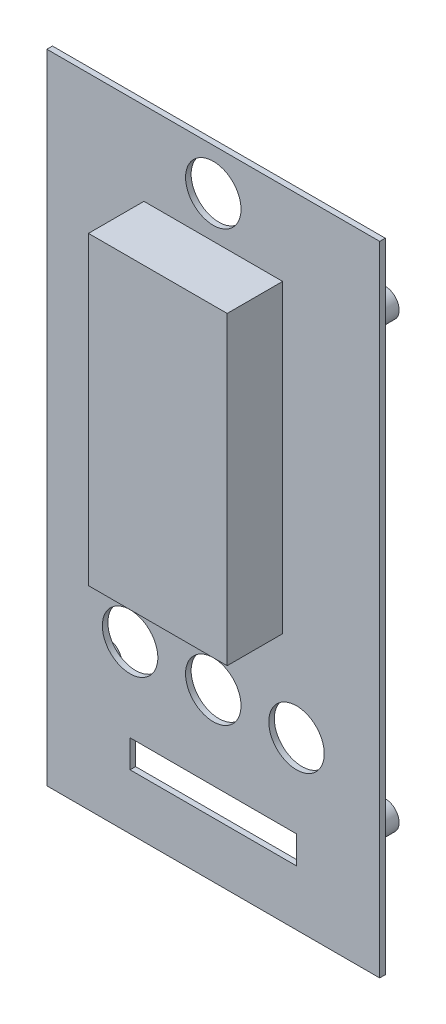
ISO-10303-21;
HEADER;
FILE_DESCRIPTION(('STEP AP214'),'2;1');
FILE_NAME('part.step','',(''),(''),'','','');
FILE_SCHEMA(('AUTOMOTIVE_DESIGN { 1 0 10303 214 1 1 1 1 }'));
ENDSEC;
DATA;
#1=APPLICATION_CONTEXT('core data for automotive mechanical design processes');
#2=APPLICATION_PROTOCOL_DEFINITION('international standard','automotive_design',2000,#1);
#3=PRODUCT_CONTEXT('',#1,'mechanical');
#4=PRODUCT('Part','Part','',(#3));
#5=PRODUCT_RELATED_PRODUCT_CATEGORY('part','',(#4));
#6=PRODUCT_DEFINITION_FORMATION('','',#4);
#7=PRODUCT_DEFINITION_CONTEXT('part definition',#1,'design');
#8=PRODUCT_DEFINITION('design','',#6,#7);
#9=PRODUCT_DEFINITION_SHAPE('','',#8);
#10=(LENGTH_UNIT() NAMED_UNIT(*) SI_UNIT(.MILLI.,.METRE.));
#11=(NAMED_UNIT(*) PLANE_ANGLE_UNIT() SI_UNIT($,.RADIAN.));
#12=(NAMED_UNIT(*) SI_UNIT($,.STERADIAN.) SOLID_ANGLE_UNIT());
#13=UNCERTAINTY_MEASURE_WITH_UNIT(LENGTH_MEASURE(1.E-05),#10,'distance_accuracy_value','');
#14=(GEOMETRIC_REPRESENTATION_CONTEXT(3) GLOBAL_UNCERTAINTY_ASSIGNED_CONTEXT((#13)) GLOBAL_UNIT_ASSIGNED_CONTEXT((#10,
#11,#12)) REPRESENTATION_CONTEXT('',''));
#15=CARTESIAN_POINT('',(0.,0.,0.));
#16=DIRECTION('',(0.,0.,1.));
#17=DIRECTION('',(1.,0.,0.));
#18=AXIS2_PLACEMENT_3D('',#15,#16,#17);
#19=CARTESIAN_POINT('',(0.,0.,-59.));
#20=DIRECTION('',(0.,0.,1.));
#21=DIRECTION('',(1.,0.,0.));
#22=AXIS2_PLACEMENT_3D('',#19,#20,#21);
#23=PLANE('',#22);
#24=DIRECTION('',(-1.,0.,0.));
#25=VECTOR('',#24,1.);
#26=CARTESIAN_POINT('',(29.9999999999996,125.,-59.));
#27=LINE('',#26,#25);
#28=CARTESIAN_POINT('',(29.9999999999996,125.,-59.));
#29=VERTEX_POINT('',#28);
#30=CARTESIAN_POINT('',(-30.0000000000004,125.,-59.));
#31=VERTEX_POINT('',#30);
#32=EDGE_CURVE('E223',#29,#31,#27,.T.);
#33=ORIENTED_EDGE('',*,*,#32,.T.);
#34=DIRECTION('',(0.,-1.,0.));
#35=VECTOR('',#34,1.);
#36=CARTESIAN_POINT('',(-30.0000000000004,125.,-59.));
#37=LINE('',#36,#35);
#38=CARTESIAN_POINT('',(-30.0000000000004,10.,-59.));
#39=VERTEX_POINT('',#38);
#40=EDGE_CURVE('E227',#31,#39,#37,.T.);
#41=ORIENTED_EDGE('',*,*,#40,.T.);
#42=DIRECTION('',(1.,0.,0.));
#43=VECTOR('',#42,1.);
#44=CARTESIAN_POINT('',(29.9999999999996,10.,-59.));
#45=LINE('',#44,#43);
#46=CARTESIAN_POINT('',(29.9999999999996,10.,-59.));
#47=VERTEX_POINT('',#46);
#48=EDGE_CURVE('E231',#39,#47,#45,.T.);
#49=ORIENTED_EDGE('',*,*,#48,.T.);
#50=DIRECTION('',(0.,1.,0.));
#51=VECTOR('',#50,1.);
#52=CARTESIAN_POINT('',(29.9999999999996,125.,-59.));
#53=LINE('',#52,#51);
#54=EDGE_CURVE('E234',#47,#29,#53,.T.);
#55=ORIENTED_EDGE('',*,*,#54,.T.);
#56=EDGE_LOOP('',(#33,#41,#49,#55));
#57=FACE_BOUND('',#56,.T.);
#58=CARTESIAN_POINT('',(-2.22044604925031E-13,117.5,-59.));
#59=DIRECTION('',(0.,0.,-1.));
#60=DIRECTION('',(-1.,0.,0.));
#61=AXIS2_PLACEMENT_3D('',#58,#59,#60);
#62=CIRCLE('',#61,5.00000000000001);
#63=CARTESIAN_POINT('',(-5.00000000000023,117.5,-59.));
#64=VERTEX_POINT('',#63);
#65=EDGE_CURVE('E207',#64,#64,#62,.T.);
#66=ORIENTED_EDGE('',*,*,#65,.T.);
#67=EDGE_LOOP('',(#66));
#68=FACE_BOUND('',#67,.T.);
#69=CARTESIAN_POINT('',(-2.22044604925031E-13,40.,-59.));
#70=DIRECTION('',(0.,0.,-1.));
#71=DIRECTION('',(-1.,0.,0.));
#72=AXIS2_PLACEMENT_3D('',#69,#70,#71);
#73=CIRCLE('',#72,5.);
#74=CARTESIAN_POINT('',(-5.00000000000023,40.,-59.));
#75=VERTEX_POINT('',#74);
#76=EDGE_CURVE('E201',#75,#75,#73,.T.);
#77=ORIENTED_EDGE('',*,*,#76,.T.);
#78=EDGE_LOOP('',(#77));
#79=FACE_BOUND('',#78,.T.);
#80=CARTESIAN_POINT('',(14.9999999999998,40.,-59.));
#81=DIRECTION('',(0.,0.,-1.));
#82=DIRECTION('',(-1.,0.,0.));
#83=AXIS2_PLACEMENT_3D('',#80,#81,#82);
#84=CIRCLE('',#83,5.);
#85=CARTESIAN_POINT('',(9.99999999999978,40.,-59.));
#86=VERTEX_POINT('',#85);
#87=EDGE_CURVE('E195',#86,#86,#84,.T.);
#88=ORIENTED_EDGE('',*,*,#87,.T.);
#89=EDGE_LOOP('',(#88));
#90=FACE_BOUND('',#89,.T.);
#91=CARTESIAN_POINT('',(-15.0000000000002,40.,-59.));
#92=DIRECTION('',(0.,0.,-1.));
#93=DIRECTION('',(-1.,0.,0.));
#94=AXIS2_PLACEMENT_3D('',#91,#92,#93);
#95=CIRCLE('',#94,5.);
#96=CARTESIAN_POINT('',(-20.0000000000002,40.,-59.));
#97=VERTEX_POINT('',#96);
#98=EDGE_CURVE('E188',#97,#97,#95,.T.);
#99=ORIENTED_EDGE('',*,*,#98,.T.);
#100=EDGE_LOOP('',(#99));
#101=FACE_BOUND('',#100,.T.);
#102=DIRECTION('',(0.,1.,0.));
#103=VECTOR('',#102,1.);
#104=CARTESIAN_POINT('',(-15.,20.,-59.));
#105=LINE('',#104,#103);
#106=CARTESIAN_POINT('',(-15.,20.,-59.));
#107=VERTEX_POINT('',#106);
#108=CARTESIAN_POINT('',(-15.,25.,-59.));
#109=VERTEX_POINT('',#108);
#110=EDGE_CURVE('E159',#107,#109,#105,.T.);
#111=ORIENTED_EDGE('',*,*,#110,.T.);
#112=DIRECTION('',(1.,0.,0.));
#113=VECTOR('',#112,1.);
#114=CARTESIAN_POINT('',(15.,25.,-59.));
#115=LINE('',#114,#113);
#116=CARTESIAN_POINT('',(15.,25.,-59.));
#117=VERTEX_POINT('',#116);
#118=EDGE_CURVE('E162',#109,#117,#115,.T.);
#119=ORIENTED_EDGE('',*,*,#118,.T.);
#120=DIRECTION('',(0.,-1.,0.));
#121=VECTOR('',#120,1.);
#122=CARTESIAN_POINT('',(15.,20.,-59.));
#123=LINE('',#122,#121);
#124=CARTESIAN_POINT('',(15.,20.,-59.));
#125=VERTEX_POINT('',#124);
#126=EDGE_CURVE('E166',#117,#125,#123,.T.);
#127=ORIENTED_EDGE('',*,*,#126,.T.);
#128=DIRECTION('',(-1.,0.,0.));
#129=VECTOR('',#128,1.);
#130=CARTESIAN_POINT('',(15.,20.,-59.));
#131=LINE('',#130,#129);
#132=EDGE_CURVE('E169',#125,#107,#131,.T.);
#133=ORIENTED_EDGE('',*,*,#132,.T.);
#134=EDGE_LOOP('',(#111,#119,#127,#133));
#135=FACE_BOUND('',#134,.T.);
#136=DIRECTION('',(1.,0.,0.));
#137=VECTOR('',#136,1.);
#138=CARTESIAN_POINT('',(-12.5000000000004,55.,-59.));
#139=LINE('',#138,#137);
#140=CARTESIAN_POINT('',(-12.5000000000004,55.,-59.));
#141=VERTEX_POINT('',#140);
#142=CARTESIAN_POINT('',(12.4999999999996,55.,-59.));
#143=VERTEX_POINT('',#142);
#144=EDGE_CURVE('E486',#141,#143,#139,.T.);
#145=ORIENTED_EDGE('',*,*,#144,.F.);
#146=DIRECTION('',(0.,-1.,0.));
#147=VECTOR('',#146,1.);
#148=CARTESIAN_POINT('',(-12.5000000000004,110.,-59.));
#149=LINE('',#148,#147);
#150=CARTESIAN_POINT('',(-12.5000000000004,110.,-59.));
#151=VERTEX_POINT('',#150);
#152=EDGE_CURVE('E151',#151,#141,#149,.T.);
#153=ORIENTED_EDGE('',*,*,#152,.F.);
#154=DIRECTION('',(-1.,0.,0.));
#155=VECTOR('',#154,1.);
#156=CARTESIAN_POINT('',(-12.5000000000004,110.,-59.));
#157=LINE('',#156,#155);
#158=CARTESIAN_POINT('',(12.4999999999996,110.,-59.));
#159=VERTEX_POINT('',#158);
#160=EDGE_CURVE('E147',#159,#151,#157,.T.);
#161=ORIENTED_EDGE('',*,*,#160,.F.);
#162=DIRECTION('',(0.,1.,0.));
#163=VECTOR('',#162,1.);
#164=CARTESIAN_POINT('',(12.4999999999996,110.,-59.));
#165=LINE('',#164,#163);
#166=EDGE_CURVE('E483',#143,#159,#165,.T.);
#167=ORIENTED_EDGE('',*,*,#166,.F.);
#168=EDGE_LOOP('',(#145,#153,#161,#167));
#169=FACE_BOUND('',#168,.T.);
#170=ADVANCED_FACE('F38',(#57,#68,#79,#90,#101,#135,#169),#23,.T.);
#171=CARTESIAN_POINT('',(0.,0.,-60.));
#172=DIRECTION('',(0.,0.,1.));
#173=DIRECTION('',(1.,0.,0.));
#174=AXIS2_PLACEMENT_3D('',#171,#172,#173);
#175=PLANE('',#174);
#176=DIRECTION('',(1.,0.,0.));
#177=VECTOR('',#176,1.);
#178=CARTESIAN_POINT('',(15.,25.,-60.));
#179=LINE('',#178,#177);
#180=CARTESIAN_POINT('',(-15.,25.,-60.));
#181=VERTEX_POINT('',#180);
#182=CARTESIAN_POINT('',(15.,25.,-60.));
#183=VERTEX_POINT('',#182);
#184=EDGE_CURVE('E154',#181,#183,#179,.T.);
#185=ORIENTED_EDGE('',*,*,#184,.F.);
#186=DIRECTION('',(0.,1.,0.));
#187=VECTOR('',#186,1.);
#188=CARTESIAN_POINT('',(-15.,20.,-60.));
#189=LINE('',#188,#187);
#190=CARTESIAN_POINT('',(-15.,20.,-60.));
#191=VERTEX_POINT('',#190);
#192=EDGE_CURVE('E61',#191,#181,#189,.T.);
#193=ORIENTED_EDGE('',*,*,#192,.F.);
#194=DIRECTION('',(-1.,0.,0.));
#195=VECTOR('',#194,1.);
#196=CARTESIAN_POINT('',(15.,20.,-60.));
#197=LINE('',#196,#195);
#198=CARTESIAN_POINT('',(15.,20.,-60.));
#199=VERTEX_POINT('',#198);
#200=EDGE_CURVE('E163',#199,#191,#197,.T.);
#201=ORIENTED_EDGE('',*,*,#200,.F.);
#202=DIRECTION('',(0.,-1.,0.));
#203=VECTOR('',#202,1.);
#204=CARTESIAN_POINT('',(15.,20.,-60.));
#205=LINE('',#204,#203);
#206=EDGE_CURVE('E175',#183,#199,#205,.T.);
#207=ORIENTED_EDGE('',*,*,#206,.F.);
#208=EDGE_LOOP('',(#185,#193,#201,#207));
#209=FACE_BOUND('',#208,.T.);
#210=CARTESIAN_POINT('',(-15.0000000000002,40.,-60.));
#211=DIRECTION('',(0.,0.,-1.));
#212=DIRECTION('',(-1.,0.,0.));
#213=AXIS2_PLACEMENT_3D('',#210,#211,#212);
#214=CIRCLE('',#213,5.);
#215=CARTESIAN_POINT('',(-20.0000000000002,40.,-60.));
#216=VERTEX_POINT('',#215);
#217=EDGE_CURVE('E182',#216,#216,#214,.T.);
#218=ORIENTED_EDGE('',*,*,#217,.F.);
#219=EDGE_LOOP('',(#218));
#220=FACE_BOUND('',#219,.T.);
#221=CARTESIAN_POINT('',(14.9999999999998,40.,-60.));
#222=DIRECTION('',(0.,0.,-1.));
#223=DIRECTION('',(-1.,0.,0.));
#224=AXIS2_PLACEMENT_3D('',#221,#222,#223);
#225=CIRCLE('',#224,5.);
#226=CARTESIAN_POINT('',(9.99999999999978,40.,-60.));
#227=VERTEX_POINT('',#226);
#228=EDGE_CURVE('E192',#227,#227,#225,.T.);
#229=ORIENTED_EDGE('',*,*,#228,.F.);
#230=EDGE_LOOP('',(#229));
#231=FACE_BOUND('',#230,.T.);
#232=CARTESIAN_POINT('',(-2.22044604925031E-13,40.,-60.));
#233=DIRECTION('',(0.,0.,-1.));
#234=DIRECTION('',(-1.,0.,0.));
#235=AXIS2_PLACEMENT_3D('',#232,#233,#234);
#236=CIRCLE('',#235,5.);
#237=CARTESIAN_POINT('',(-5.00000000000023,40.,-60.));
#238=VERTEX_POINT('',#237);
#239=EDGE_CURVE('E198',#238,#238,#236,.T.);
#240=ORIENTED_EDGE('',*,*,#239,.F.);
#241=EDGE_LOOP('',(#240));
#242=FACE_BOUND('',#241,.T.);
#243=CARTESIAN_POINT('',(-2.22044604925031E-13,117.5,-60.));
#244=DIRECTION('',(0.,0.,-1.));
#245=DIRECTION('',(-1.,0.,0.));
#246=AXIS2_PLACEMENT_3D('',#243,#244,#245);
#247=CIRCLE('',#246,5.00000000000001);
#248=CARTESIAN_POINT('',(-5.00000000000023,117.5,-60.));
#249=VERTEX_POINT('',#248);
#250=EDGE_CURVE('E204',#249,#249,#247,.T.);
#251=ORIENTED_EDGE('',*,*,#250,.F.);
#252=EDGE_LOOP('',(#251));
#253=FACE_BOUND('',#252,.T.);
#254=CARTESIAN_POINT('',(25.,30.0000000000001,-60.));
#255=DIRECTION('',(0.,0.,1.));
#256=DIRECTION('',(1.,0.,0.));
#257=AXIS2_PLACEMENT_3D('',#254,#255,#256);
#258=CIRCLE('',#257,2.5);
#259=CARTESIAN_POINT('',(27.5,30.0000000000001,-60.));
#260=VERTEX_POINT('',#259);
#261=EDGE_CURVE('E46',#260,#260,#258,.F.);
#262=ORIENTED_EDGE('',*,*,#261,.F.);
#263=EDGE_LOOP('',(#262));
#264=FACE_BOUND('',#263,.T.);
#265=CARTESIAN_POINT('',(-25.,110.,-60.));
#266=DIRECTION('',(0.,0.,1.));
#267=DIRECTION('',(1.,0.,0.));
#268=AXIS2_PLACEMENT_3D('',#265,#266,#267);
#269=CIRCLE('',#268,2.5);
#270=CARTESIAN_POINT('',(-22.5,110.,-60.));
#271=VERTEX_POINT('',#270);
#272=EDGE_CURVE('E259',#271,#271,#269,.T.);
#273=ORIENTED_EDGE('',*,*,#272,.T.);
#274=EDGE_LOOP('',(#273));
#275=FACE_BOUND('',#274,.T.);
#276=DIRECTION('',(-1.,0.,0.));
#277=VECTOR('',#276,1.);
#278=CARTESIAN_POINT('',(29.9999999999996,125.,-60.));
#279=LINE('',#278,#277);
#280=CARTESIAN_POINT('',(29.9999999999996,125.,-60.));
#281=VERTEX_POINT('',#280);
#282=CARTESIAN_POINT('',(-30.0000000000004,125.,-60.));
#283=VERTEX_POINT('',#282);
#284=EDGE_CURVE('E222',#281,#283,#279,.T.);
#285=ORIENTED_EDGE('',*,*,#284,.F.);
#286=DIRECTION('',(0.,1.,0.));
#287=VECTOR('',#286,1.);
#288=CARTESIAN_POINT('',(29.9999999999996,125.,-60.));
#289=LINE('',#288,#287);
#290=CARTESIAN_POINT('',(29.9999999999996,10.,-60.));
#291=VERTEX_POINT('',#290);
#292=EDGE_CURVE('E228',#291,#281,#289,.T.);
#293=ORIENTED_EDGE('',*,*,#292,.F.);
#294=DIRECTION('',(1.,0.,0.));
#295=VECTOR('',#294,1.);
#296=CARTESIAN_POINT('',(29.9999999999996,10.,-60.));
#297=LINE('',#296,#295);
#298=CARTESIAN_POINT('',(-30.0000000000004,10.,-60.));
#299=VERTEX_POINT('',#298);
#300=EDGE_CURVE('E243',#299,#291,#297,.T.);
#301=ORIENTED_EDGE('',*,*,#300,.F.);
#302=DIRECTION('',(0.,-1.,0.));
#303=VECTOR('',#302,1.);
#304=CARTESIAN_POINT('',(-30.0000000000004,125.,-60.));
#305=LINE('',#304,#303);
#306=EDGE_CURVE('E241',#283,#299,#305,.T.);
#307=ORIENTED_EDGE('',*,*,#306,.F.);
#308=EDGE_LOOP('',(#285,#293,#301,#307));
#309=FACE_BOUND('',#308,.T.);
#310=CARTESIAN_POINT('',(25.,110.,-60.));
#311=DIRECTION('',(0.,0.,1.));
#312=DIRECTION('',(1.,0.,0.));
#313=AXIS2_PLACEMENT_3D('',#310,#311,#312);
#314=CIRCLE('',#313,2.5);
#315=CARTESIAN_POINT('',(27.5,110.,-60.));
#316=VERTEX_POINT('',#315);
#317=EDGE_CURVE('E262',#316,#316,#314,.F.);
#318=ORIENTED_EDGE('',*,*,#317,.F.);
#319=EDGE_LOOP('',(#318));
#320=FACE_BOUND('',#319,.T.);
#321=CARTESIAN_POINT('',(-25.,30.0000000000001,-60.));
#322=DIRECTION('',(0.,0.,1.));
#323=DIRECTION('',(1.,0.,0.));
#324=AXIS2_PLACEMENT_3D('',#321,#322,#323);
#325=CIRCLE('',#324,2.5);
#326=CARTESIAN_POINT('',(-22.5,30.0000000000001,-60.));
#327=VERTEX_POINT('',#326);
#328=EDGE_CURVE('E11',#327,#327,#325,.F.);
#329=ORIENTED_EDGE('',*,*,#328,.F.);
#330=EDGE_LOOP('',(#329));
#331=FACE_BOUND('',#330,.T.);
#332=ADVANCED_FACE('F275',(#209,#220,#231,#242,#253,#264,#275,#309,#320,#331),#175,.F.);
#333=CARTESIAN_POINT('',(-25.,110.,-60.));
#334=DIRECTION('',(0.,0.,-1.));
#335=DIRECTION('',(-1.,0.,0.));
#336=AXIS2_PLACEMENT_3D('',#333,#334,#335);
#337=CYLINDRICAL_SURFACE('',#336,2.5);
#338=ORIENTED_EDGE('',*,*,#272,.F.);
#339=EDGE_LOOP('',(#338));
#340=FACE_BOUND('',#339,.T.);
#341=CARTESIAN_POINT('',(-25.,110.,-65.));
#342=DIRECTION('',(0.,0.,1.));
#343=DIRECTION('',(1.,0.,0.));
#344=AXIS2_PLACEMENT_3D('',#341,#342,#343);
#345=CIRCLE('',#344,2.5);
#346=CARTESIAN_POINT('',(-22.5,110.,-65.));
#347=VERTEX_POINT('',#346);
#348=EDGE_CURVE('E258',#347,#347,#345,.T.);
#349=ORIENTED_EDGE('',*,*,#348,.T.);
#350=EDGE_LOOP('',(#349));
#351=FACE_BOUND('',#350,.T.);
#352=ADVANCED_FACE('F40',(#340,#351),#337,.T.);
#353=CARTESIAN_POINT('',(-25.,110.,-65.));
#354=DIRECTION('',(0.,0.,1.));
#355=DIRECTION('',(1.,0.,0.));
#356=AXIS2_PLACEMENT_3D('',#353,#354,#355);
#357=PLANE('',#356);
#358=ORIENTED_EDGE('',*,*,#348,.F.);
#359=EDGE_LOOP('',(#358));
#360=FACE_BOUND('',#359,.T.);
#361=ADVANCED_FACE('F330',(#360),#357,.F.);
#362=CARTESIAN_POINT('',(29.9999999999996,125.,-59.));
#363=DIRECTION('',(0.,-1.,0.));
#364=DIRECTION('',(0.,0.,-1.));
#365=AXIS2_PLACEMENT_3D('',#362,#363,#364);
#366=PLANE('',#365);
#367=ORIENTED_EDGE('',*,*,#284,.T.);
#368=DIRECTION('',(0.,0.,-1.));
#369=VECTOR('',#368,1.);
#370=CARTESIAN_POINT('',(-30.0000000000004,125.,-59.));
#371=LINE('',#370,#369);
#372=EDGE_CURVE('E255',#31,#283,#371,.T.);
#373=ORIENTED_EDGE('',*,*,#372,.F.);
#374=ORIENTED_EDGE('',*,*,#32,.F.);
#375=DIRECTION('',(0.,0.,-1.));
#376=VECTOR('',#375,1.);
#377=CARTESIAN_POINT('',(29.9999999999996,125.,-59.));
#378=LINE('',#377,#376);
#379=EDGE_CURVE('E237',#29,#281,#378,.T.);
#380=ORIENTED_EDGE('',*,*,#379,.T.);
#381=EDGE_LOOP('',(#367,#373,#374,#380));
#382=FACE_BOUND('',#381,.T.);
#383=ADVANCED_FACE('F327',(#382),#366,.F.);
#384=CARTESIAN_POINT('',(-30.0000000000004,125.,-59.));
#385=DIRECTION('',(1.,0.,0.));
#386=DIRECTION('',(0.,0.,-1.));
#387=AXIS2_PLACEMENT_3D('',#384,#385,#386);
#388=PLANE('',#387);
#389=ORIENTED_EDGE('',*,*,#306,.T.);
#390=DIRECTION('',(0.,0.,-1.));
#391=VECTOR('',#390,1.);
#392=CARTESIAN_POINT('',(-30.0000000000004,10.,-59.));
#393=LINE('',#392,#391);
#394=EDGE_CURVE('E252',#39,#299,#393,.T.);
#395=ORIENTED_EDGE('',*,*,#394,.F.);
#396=ORIENTED_EDGE('',*,*,#40,.F.);
#397=ORIENTED_EDGE('',*,*,#372,.T.);
#398=EDGE_LOOP('',(#389,#395,#396,#397));
#399=FACE_BOUND('',#398,.T.);
#400=ADVANCED_FACE('F323',(#399),#388,.F.);
#401=CARTESIAN_POINT('',(29.9999999999996,10.,-59.));
#402=DIRECTION('',(0.,1.,0.));
#403=DIRECTION('',(0.,0.,1.));
#404=AXIS2_PLACEMENT_3D('',#401,#402,#403);
#405=PLANE('',#404);
#406=ORIENTED_EDGE('',*,*,#300,.T.);
#407=DIRECTION('',(0.,0.,-1.));
#408=VECTOR('',#407,1.);
#409=CARTESIAN_POINT('',(29.9999999999996,10.,-59.));
#410=LINE('',#409,#408);
#411=EDGE_CURVE('E249',#47,#291,#410,.T.);
#412=ORIENTED_EDGE('',*,*,#411,.F.);
#413=ORIENTED_EDGE('',*,*,#48,.F.);
#414=ORIENTED_EDGE('',*,*,#394,.T.);
#415=EDGE_LOOP('',(#406,#412,#413,#414));
#416=FACE_BOUND('',#415,.T.);
#417=ADVANCED_FACE('F319',(#416),#405,.F.);
#418=CARTESIAN_POINT('',(29.9999999999996,125.,-59.));
#419=DIRECTION('',(-1.,0.,0.));
#420=DIRECTION('',(0.,0.,1.));
#421=AXIS2_PLACEMENT_3D('',#418,#419,#420);
#422=PLANE('',#421);
#423=ORIENTED_EDGE('',*,*,#292,.T.);
#424=ORIENTED_EDGE('',*,*,#379,.F.);
#425=ORIENTED_EDGE('',*,*,#54,.F.);
#426=ORIENTED_EDGE('',*,*,#411,.T.);
#427=EDGE_LOOP('',(#423,#424,#425,#426));
#428=FACE_BOUND('',#427,.T.);
#429=ADVANCED_FACE('F316',(#428),#422,.F.);
#430=CARTESIAN_POINT('',(25.,110.,-60.));
#431=DIRECTION('',(0.,0.,-1.));
#432=DIRECTION('',(-1.,0.,0.));
#433=AXIS2_PLACEMENT_3D('',#430,#431,#432);
#434=CYLINDRICAL_SURFACE('',#433,2.5);
#435=ORIENTED_EDGE('',*,*,#317,.T.);
#436=EDGE_LOOP('',(#435));
#437=FACE_BOUND('',#436,.T.);
#438=CARTESIAN_POINT('',(25.,110.,-65.));
#439=DIRECTION('',(0.,0.,1.));
#440=DIRECTION('',(1.,0.,0.));
#441=AXIS2_PLACEMENT_3D('',#438,#439,#440);
#442=CIRCLE('',#441,2.5);
#443=CARTESIAN_POINT('',(27.5,110.,-65.));
#444=VERTEX_POINT('',#443);
#445=EDGE_CURVE('E218',#444,#444,#442,.T.);
#446=ORIENTED_EDGE('',*,*,#445,.T.);
#447=EDGE_LOOP('',(#446));
#448=FACE_BOUND('',#447,.T.);
#449=ADVANCED_FACE('F313',(#437,#448),#434,.T.);
#450=CARTESIAN_POINT('',(25.,110.,-65.));
#451=DIRECTION('',(0.,0.,1.));
#452=DIRECTION('',(1.,0.,0.));
#453=AXIS2_PLACEMENT_3D('',#450,#451,#452);
#454=PLANE('',#453);
#455=ORIENTED_EDGE('',*,*,#445,.F.);
#456=EDGE_LOOP('',(#455));
#457=FACE_BOUND('',#456,.T.);
#458=ADVANCED_FACE('F568',(#457),#454,.F.);
#459=CARTESIAN_POINT('',(25.,30.0000000000001,-60.));
#460=DIRECTION('',(0.,0.,-1.));
#461=DIRECTION('',(-1.,0.,0.));
#462=AXIS2_PLACEMENT_3D('',#459,#460,#461);
#463=CYLINDRICAL_SURFACE('',#462,2.5);
#464=ORIENTED_EDGE('',*,*,#261,.T.);
#465=EDGE_LOOP('',(#464));
#466=FACE_BOUND('',#465,.T.);
#467=CARTESIAN_POINT('',(25.,30.0000000000001,-65.));
#468=DIRECTION('',(0.,0.,1.));
#469=DIRECTION('',(1.,0.,0.));
#470=AXIS2_PLACEMENT_3D('',#467,#468,#469);
#471=CIRCLE('',#470,2.5);
#472=CARTESIAN_POINT('',(27.5,30.0000000000001,-65.));
#473=VERTEX_POINT('',#472);
#474=EDGE_CURVE('E215',#473,#473,#471,.T.);
#475=ORIENTED_EDGE('',*,*,#474,.T.);
#476=EDGE_LOOP('',(#475));
#477=FACE_BOUND('',#476,.T.);
#478=ADVANCED_FACE('F272',(#466,#477),#463,.T.);
#479=CARTESIAN_POINT('',(25.,30.0000000000001,-65.));
#480=DIRECTION('',(0.,0.,1.));
#481=DIRECTION('',(1.,0.,0.));
#482=AXIS2_PLACEMENT_3D('',#479,#480,#481);
#483=PLANE('',#482);
#484=ORIENTED_EDGE('',*,*,#474,.F.);
#485=EDGE_LOOP('',(#484));
#486=FACE_BOUND('',#485,.T.);
#487=ADVANCED_FACE('F293',(#486),#483,.F.);
#488=CARTESIAN_POINT('',(-25.,30.0000000000001,-60.));
#489=DIRECTION('',(0.,0.,-1.));
#490=DIRECTION('',(-1.,0.,0.));
#491=AXIS2_PLACEMENT_3D('',#488,#489,#490);
#492=CYLINDRICAL_SURFACE('',#491,2.5);
#493=ORIENTED_EDGE('',*,*,#328,.T.);
#494=EDGE_LOOP('',(#493));
#495=FACE_BOUND('',#494,.T.);
#496=CARTESIAN_POINT('',(-25.,30.0000000000001,-65.));
#497=DIRECTION('',(0.,0.,1.));
#498=DIRECTION('',(1.,0.,0.));
#499=AXIS2_PLACEMENT_3D('',#496,#497,#498);
#500=CIRCLE('',#499,2.5);
#501=CARTESIAN_POINT('',(-22.5,30.0000000000001,-65.));
#502=VERTEX_POINT('',#501);
#503=EDGE_CURVE('E210',#502,#502,#500,.T.);
#504=ORIENTED_EDGE('',*,*,#503,.T.);
#505=EDGE_LOOP('',(#504));
#506=FACE_BOUND('',#505,.T.);
#507=ADVANCED_FACE('F289',(#495,#506),#492,.T.);
#508=CARTESIAN_POINT('',(-25.,30.0000000000001,-65.));
#509=DIRECTION('',(0.,0.,1.));
#510=DIRECTION('',(1.,0.,0.));
#511=AXIS2_PLACEMENT_3D('',#508,#509,#510);
#512=PLANE('',#511);
#513=ORIENTED_EDGE('',*,*,#503,.F.);
#514=EDGE_LOOP('',(#513));
#515=FACE_BOUND('',#514,.T.);
#516=ADVANCED_FACE('F292',(#515),#512,.F.);
#517=CARTESIAN_POINT('',(-2.22044604925031E-13,117.5,-59.));
#518=DIRECTION('',(0.,0.,-1.));
#519=DIRECTION('',(-1.,0.,0.));
#520=AXIS2_PLACEMENT_3D('',#517,#518,#519);
#521=CYLINDRICAL_SURFACE('',#520,5.00000000000001);
#522=ORIENTED_EDGE('',*,*,#65,.F.);
#523=EDGE_LOOP('',(#522));
#524=FACE_BOUND('',#523,.T.);
#525=ORIENTED_EDGE('',*,*,#250,.T.);
#526=EDGE_LOOP('',(#525));
#527=FACE_BOUND('',#526,.T.);
#528=ADVANCED_FACE('F298',(#524,#527),#521,.F.);
#529=CARTESIAN_POINT('',(-2.22044604925031E-13,40.,-59.));
#530=DIRECTION('',(0.,0.,-1.));
#531=DIRECTION('',(-1.,0.,0.));
#532=AXIS2_PLACEMENT_3D('',#529,#530,#531);
#533=CYLINDRICAL_SURFACE('',#532,5.);
#534=ORIENTED_EDGE('',*,*,#76,.F.);
#535=EDGE_LOOP('',(#534));
#536=FACE_BOUND('',#535,.T.);
#537=ORIENTED_EDGE('',*,*,#239,.T.);
#538=EDGE_LOOP('',(#537));
#539=FACE_BOUND('',#538,.T.);
#540=ADVANCED_FACE('F303',(#536,#539),#533,.F.);
#541=CARTESIAN_POINT('',(14.9999999999998,40.,-59.));
#542=DIRECTION('',(0.,0.,-1.));
#543=DIRECTION('',(-1.,0.,0.));
#544=AXIS2_PLACEMENT_3D('',#541,#542,#543);
#545=CYLINDRICAL_SURFACE('',#544,5.);
#546=ORIENTED_EDGE('',*,*,#87,.F.);
#547=EDGE_LOOP('',(#546));
#548=FACE_BOUND('',#547,.T.);
#549=ORIENTED_EDGE('',*,*,#228,.T.);
#550=EDGE_LOOP('',(#549));
#551=FACE_BOUND('',#550,.T.);
#552=ADVANCED_FACE('F366',(#548,#551),#545,.F.);
#553=CARTESIAN_POINT('',(-15.0000000000002,40.,-59.));
#554=DIRECTION('',(0.,0.,-1.));
#555=DIRECTION('',(-1.,0.,0.));
#556=AXIS2_PLACEMENT_3D('',#553,#554,#555);
#557=CYLINDRICAL_SURFACE('',#556,5.);
#558=ORIENTED_EDGE('',*,*,#98,.F.);
#559=EDGE_LOOP('',(#558));
#560=FACE_BOUND('',#559,.T.);
#561=ORIENTED_EDGE('',*,*,#217,.T.);
#562=EDGE_LOOP('',(#561));
#563=FACE_BOUND('',#562,.T.);
#564=ADVANCED_FACE('F376',(#560,#563),#557,.F.);
#565=CARTESIAN_POINT('',(-15.,20.,-59.));
#566=DIRECTION('',(-1.,0.,0.));
#567=DIRECTION('',(0.,0.,1.));
#568=AXIS2_PLACEMENT_3D('',#565,#566,#567);
#569=PLANE('',#568);
#570=ORIENTED_EDGE('',*,*,#192,.T.);
#571=DIRECTION('',(0.,0.,-1.));
#572=VECTOR('',#571,1.);
#573=CARTESIAN_POINT('',(-15.,25.,-59.));
#574=LINE('',#573,#572);
#575=EDGE_CURVE('E171',#109,#181,#574,.T.);
#576=ORIENTED_EDGE('',*,*,#575,.F.);
#577=ORIENTED_EDGE('',*,*,#110,.F.);
#578=DIRECTION('',(0.,0.,-1.));
#579=VECTOR('',#578,1.);
#580=CARTESIAN_POINT('',(-15.,20.,-59.));
#581=LINE('',#580,#579);
#582=EDGE_CURVE('E180',#107,#191,#581,.T.);
#583=ORIENTED_EDGE('',*,*,#582,.T.);
#584=EDGE_LOOP('',(#570,#576,#577,#583));
#585=FACE_BOUND('',#584,.T.);
#586=ADVANCED_FACE('F386',(#585),#569,.F.);
#587=CARTESIAN_POINT('',(15.,20.,-59.));
#588=DIRECTION('',(0.,-1.,0.));
#589=DIRECTION('',(0.,0.,-1.));
#590=AXIS2_PLACEMENT_3D('',#587,#588,#589);
#591=PLANE('',#590);
#592=ORIENTED_EDGE('',*,*,#200,.T.);
#593=ORIENTED_EDGE('',*,*,#582,.F.);
#594=ORIENTED_EDGE('',*,*,#132,.F.);
#595=DIRECTION('',(0.,0.,-1.));
#596=VECTOR('',#595,1.);
#597=CARTESIAN_POINT('',(15.,20.,-59.));
#598=LINE('',#597,#596);
#599=EDGE_CURVE('E183',#125,#199,#598,.T.);
#600=ORIENTED_EDGE('',*,*,#599,.T.);
#601=EDGE_LOOP('',(#592,#593,#594,#600));
#602=FACE_BOUND('',#601,.T.);
#603=ADVANCED_FACE('F396',(#602),#591,.F.);
#604=CARTESIAN_POINT('',(15.,20.,-59.));
#605=DIRECTION('',(1.,0.,0.));
#606=DIRECTION('',(0.,0.,-1.));
#607=AXIS2_PLACEMENT_3D('',#604,#605,#606);
#608=PLANE('',#607);
#609=ORIENTED_EDGE('',*,*,#206,.T.);
#610=ORIENTED_EDGE('',*,*,#599,.F.);
#611=ORIENTED_EDGE('',*,*,#126,.F.);
#612=DIRECTION('',(0.,0.,-1.));
#613=VECTOR('',#612,1.);
#614=CARTESIAN_POINT('',(15.,25.,-59.));
#615=LINE('',#614,#613);
#616=EDGE_CURVE('E185',#117,#183,#615,.T.);
#617=ORIENTED_EDGE('',*,*,#616,.T.);
#618=EDGE_LOOP('',(#609,#610,#611,#617));
#619=FACE_BOUND('',#618,.T.);
#620=ADVANCED_FACE('F405',(#619),#608,.F.);
#621=CARTESIAN_POINT('',(15.,25.,-59.));
#622=DIRECTION('',(0.,1.,0.));
#623=DIRECTION('',(0.,0.,1.));
#624=AXIS2_PLACEMENT_3D('',#621,#622,#623);
#625=PLANE('',#624);
#626=ORIENTED_EDGE('',*,*,#184,.T.);
#627=ORIENTED_EDGE('',*,*,#616,.F.);
#628=ORIENTED_EDGE('',*,*,#118,.F.);
#629=ORIENTED_EDGE('',*,*,#575,.T.);
#630=EDGE_LOOP('',(#626,#627,#628,#629));
#631=FACE_BOUND('',#630,.T.);
#632=ADVANCED_FACE('F415',(#631),#625,.F.);
#633=CARTESIAN_POINT('',(-12.5000000000004,110.,-49.));
#634=DIRECTION('',(1.,0.,0.));
#635=DIRECTION('',(0.,0.,-1.));
#636=AXIS2_PLACEMENT_3D('',#633,#634,#635);
#637=PLANE('',#636);
#638=ORIENTED_EDGE('',*,*,#152,.T.);
#639=DIRECTION('',(0.,0.,-1.));
#640=VECTOR('',#639,1.);
#641=CARTESIAN_POINT('',(-12.5000000000004,55.,-49.));
#642=LINE('',#641,#640);
#643=CARTESIAN_POINT('',(-12.5000000000004,55.,-49.));
#644=VERTEX_POINT('',#643);
#645=EDGE_CURVE('E131',#644,#141,#642,.T.);
#646=ORIENTED_EDGE('',*,*,#645,.F.);
#647=DIRECTION('',(0.,-1.,0.));
#648=VECTOR('',#647,1.);
#649=CARTESIAN_POINT('',(-12.5000000000004,110.,-49.));
#650=LINE('',#649,#648);
#651=CARTESIAN_POINT('',(-12.5000000000004,110.,-49.));
#652=VERTEX_POINT('',#651);
#653=EDGE_CURVE('E139',#652,#644,#650,.T.);
#654=ORIENTED_EDGE('',*,*,#653,.F.);
#655=DIRECTION('',(0.,0.,-1.));
#656=VECTOR('',#655,1.);
#657=CARTESIAN_POINT('',(-12.5000000000004,110.,-49.));
#658=LINE('',#657,#656);
#659=EDGE_CURVE('E479',#652,#151,#658,.T.);
#660=ORIENTED_EDGE('',*,*,#659,.T.);
#661=EDGE_LOOP('',(#638,#646,#654,#660));
#662=FACE_BOUND('',#661,.T.);
#663=ADVANCED_FACE('F149',(#662),#637,.F.);
#664=CARTESIAN_POINT('',(-12.5000000000004,55.,-49.));
#665=DIRECTION('',(0.,1.,0.));
#666=DIRECTION('',(-1.,0.,0.));
#667=AXIS2_PLACEMENT_3D('',#664,#665,#666);
#668=PLANE('',#667);
#669=ORIENTED_EDGE('',*,*,#144,.T.);
#670=DIRECTION('',(0.,0.,-1.));
#671=VECTOR('',#670,1.);
#672=CARTESIAN_POINT('',(12.4999999999996,55.,-49.));
#673=LINE('',#672,#671);
#674=CARTESIAN_POINT('',(12.4999999999996,55.,-49.));
#675=VERTEX_POINT('',#674);
#676=EDGE_CURVE('E134',#675,#143,#673,.T.);
#677=ORIENTED_EDGE('',*,*,#676,.F.);
#678=DIRECTION('',(1.,0.,0.));
#679=VECTOR('',#678,1.);
#680=CARTESIAN_POINT('',(-12.5000000000004,55.,-49.));
#681=LINE('',#680,#679);
#682=EDGE_CURVE('E127',#644,#675,#681,.T.);
#683=ORIENTED_EDGE('',*,*,#682,.F.);
#684=ORIENTED_EDGE('',*,*,#645,.T.);
#685=EDGE_LOOP('',(#669,#677,#683,#684));
#686=FACE_BOUND('',#685,.T.);
#687=ADVANCED_FACE('F129',(#686),#668,.F.);
#688=CARTESIAN_POINT('',(12.4999999999996,110.,-49.));
#689=DIRECTION('',(-1.,0.,0.));
#690=DIRECTION('',(0.,0.,1.));
#691=AXIS2_PLACEMENT_3D('',#688,#689,#690);
#692=PLANE('',#691);
#693=ORIENTED_EDGE('',*,*,#166,.T.);
#694=DIRECTION('',(0.,0.,-1.));
#695=VECTOR('',#694,1.);
#696=CARTESIAN_POINT('',(12.4999999999996,110.,-49.));
#697=LINE('',#696,#695);
#698=CARTESIAN_POINT('',(12.4999999999996,110.,-49.));
#699=VERTEX_POINT('',#698);
#700=EDGE_CURVE('E53',#699,#159,#697,.T.);
#701=ORIENTED_EDGE('',*,*,#700,.F.);
#702=DIRECTION('',(0.,1.,0.));
#703=VECTOR('',#702,1.);
#704=CARTESIAN_POINT('',(12.4999999999996,110.,-49.));
#705=LINE('',#704,#703);
#706=EDGE_CURVE('E138',#675,#699,#705,.T.);
#707=ORIENTED_EDGE('',*,*,#706,.F.);
#708=ORIENTED_EDGE('',*,*,#676,.T.);
#709=EDGE_LOOP('',(#693,#701,#707,#708));
#710=FACE_BOUND('',#709,.T.);
#711=ADVANCED_FACE('F448',(#710),#692,.F.);
#712=CARTESIAN_POINT('',(-12.5000000000004,110.,-49.));
#713=DIRECTION('',(0.,-1.,0.));
#714=DIRECTION('',(0.,0.,-1.));
#715=AXIS2_PLACEMENT_3D('',#712,#713,#714);
#716=PLANE('',#715);
#717=ORIENTED_EDGE('',*,*,#160,.T.);
#718=ORIENTED_EDGE('',*,*,#659,.F.);
#719=DIRECTION('',(-1.,0.,0.));
#720=VECTOR('',#719,1.);
#721=CARTESIAN_POINT('',(-12.5000000000004,110.,-49.));
#722=LINE('',#721,#720);
#723=EDGE_CURVE('E143',#699,#652,#722,.T.);
#724=ORIENTED_EDGE('',*,*,#723,.F.);
#725=ORIENTED_EDGE('',*,*,#700,.T.);
#726=EDGE_LOOP('',(#717,#718,#724,#725));
#727=FACE_BOUND('',#726,.T.);
#728=ADVANCED_FACE('F457',(#727),#716,.F.);
#729=CARTESIAN_POINT('',(0.,0.,-49.));
#730=DIRECTION('',(0.,0.,1.));
#731=DIRECTION('',(1.,0.,0.));
#732=AXIS2_PLACEMENT_3D('',#729,#730,#731);
#733=PLANE('',#732);
#734=ORIENTED_EDGE('',*,*,#653,.T.);
#735=ORIENTED_EDGE('',*,*,#682,.T.);
#736=ORIENTED_EDGE('',*,*,#706,.T.);
#737=ORIENTED_EDGE('',*,*,#723,.T.);
#738=EDGE_LOOP('',(#734,#735,#736,#737));
#739=FACE_BOUND('',#738,.T.);
#740=ADVANCED_FACE('F142',(#739),#733,.T.);
#741=CLOSED_SHELL('',(#170,#332,#352,#361,#383,#400,#417,#429,#449,#458,#478,#487,#507,#516,
#528,#540,#552,#564,#586,#603,#620,#632,#663,#687,#711,#728,#740));
#742=MANIFOLD_SOLID_BREP('B2',#741);
#743=ADVANCED_BREP_SHAPE_REPRESENTATION('',(#18,#742),#14);
#744=SHAPE_DEFINITION_REPRESENTATION(#9,#743);
ENDSEC;
END-ISO-10303-21;
